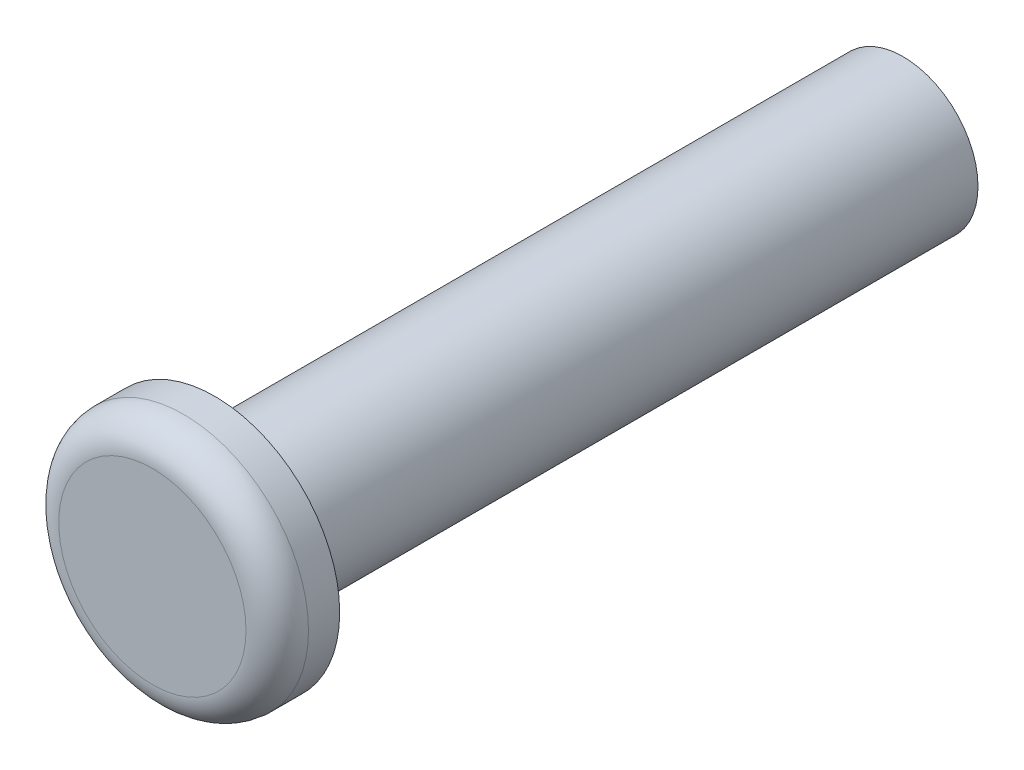
ISO-10303-21;
HEADER;
FILE_DESCRIPTION(('STEP AP214'),'2;1');
FILE_NAME('part.step','',(''),(''),'','','');
FILE_SCHEMA(('AUTOMOTIVE_DESIGN { 1 0 10303 214 1 1 1 1 }'));
ENDSEC;
DATA;
#1=APPLICATION_CONTEXT('core data for automotive mechanical design processes');
#2=APPLICATION_PROTOCOL_DEFINITION('international standard','automotive_design',2000,#1);
#3=PRODUCT_CONTEXT('',#1,'mechanical');
#4=PRODUCT('Part','Part','',(#3));
#5=PRODUCT_RELATED_PRODUCT_CATEGORY('part','',(#4));
#6=PRODUCT_DEFINITION_FORMATION('','',#4);
#7=PRODUCT_DEFINITION_CONTEXT('part definition',#1,'design');
#8=PRODUCT_DEFINITION('design','',#6,#7);
#9=PRODUCT_DEFINITION_SHAPE('','',#8);
#10=(LENGTH_UNIT() NAMED_UNIT(*) SI_UNIT(.MILLI.,.METRE.));
#11=(NAMED_UNIT(*) PLANE_ANGLE_UNIT() SI_UNIT($,.RADIAN.));
#12=(NAMED_UNIT(*) SI_UNIT($,.STERADIAN.) SOLID_ANGLE_UNIT());
#13=UNCERTAINTY_MEASURE_WITH_UNIT(LENGTH_MEASURE(1.E-05),#10,'distance_accuracy_value','');
#14=(GEOMETRIC_REPRESENTATION_CONTEXT(3) GLOBAL_UNCERTAINTY_ASSIGNED_CONTEXT((#13)) GLOBAL_UNIT_ASSIGNED_CONTEXT((#10,
#11,#12)) REPRESENTATION_CONTEXT('',''));
#15=CARTESIAN_POINT('',(0.,0.,0.));
#16=DIRECTION('',(0.,0.,1.));
#17=DIRECTION('',(1.,0.,0.));
#18=AXIS2_PLACEMENT_3D('',#15,#16,#17);
#19=CARTESIAN_POINT('',(0.,0.,-35.));
#20=DIRECTION('',(0.,0.,1.));
#21=DIRECTION('',(1.,0.,0.));
#22=AXIS2_PLACEMENT_3D('',#19,#20,#21);
#23=CYLINDRICAL_SURFACE('',#22,3.81);
#24=CARTESIAN_POINT('',(0.,0.,-35.));
#25=DIRECTION('',(0.,0.,1.));
#26=DIRECTION('',(1.,0.,0.));
#27=AXIS2_PLACEMENT_3D('',#24,#25,#26);
#28=CIRCLE('',#27,3.81);
#29=CARTESIAN_POINT('',(3.81,0.,-35.));
#30=VERTEX_POINT('',#29);
#31=EDGE_CURVE('E43',#30,#30,#28,.T.);
#32=ORIENTED_EDGE('',*,*,#31,.T.);
#33=EDGE_LOOP('',(#32));
#34=FACE_BOUND('',#33,.T.);
#35=CARTESIAN_POINT('',(0.,0.,0.));
#36=DIRECTION('',(0.,0.,1.));
#37=DIRECTION('',(1.,0.,0.));
#38=AXIS2_PLACEMENT_3D('',#35,#36,#37);
#39=CIRCLE('',#38,3.81);
#40=CARTESIAN_POINT('',(3.81,0.,0.));
#41=VERTEX_POINT('',#40);
#42=EDGE_CURVE('E47',#41,#41,#39,.T.);
#43=ORIENTED_EDGE('',*,*,#42,.F.);
#44=EDGE_LOOP('',(#43));
#45=FACE_BOUND('',#44,.T.);
#46=ADVANCED_FACE('F32',(#34,#45),#23,.T.);
#47=CARTESIAN_POINT('',(0.,0.,-35.));
#48=DIRECTION('',(0.,0.,1.));
#49=DIRECTION('',(1.,0.,0.));
#50=AXIS2_PLACEMENT_3D('',#47,#48,#49);
#51=PLANE('',#50);
#52=ORIENTED_EDGE('',*,*,#31,.F.);
#53=EDGE_LOOP('',(#52));
#54=FACE_BOUND('',#53,.T.);
#55=ADVANCED_FACE('F71',(#54),#51,.F.);
#56=CARTESIAN_POINT('',(0.,0.,3.175));
#57=DIRECTION('',(0.,0.,-1.));
#58=DIRECTION('',(-1.,0.,0.));
#59=AXIS2_PLACEMENT_3D('',#56,#57,#58);
#60=CYLINDRICAL_SURFACE('',#59,6.35);
#61=CARTESIAN_POINT('',(0.,0.,1.5875));
#62=DIRECTION('',(0.,0.,1.));
#63=DIRECTION('',(1.,0.,0.));
#64=AXIS2_PLACEMENT_3D('',#61,#62,#63);
#65=CIRCLE('',#64,6.35);
#66=CARTESIAN_POINT('',(6.35,0.,1.5875));
#67=VERTEX_POINT('',#66);
#68=EDGE_CURVE('E10',#67,#67,#65,.F.);
#69=ORIENTED_EDGE('',*,*,#68,.T.);
#70=EDGE_LOOP('',(#69));
#71=FACE_BOUND('',#70,.T.);
#72=CARTESIAN_POINT('',(0.,0.,0.));
#73=DIRECTION('',(0.,0.,1.));
#74=DIRECTION('',(1.,0.,0.));
#75=AXIS2_PLACEMENT_3D('',#72,#73,#74);
#76=CIRCLE('',#75,6.35);
#77=CARTESIAN_POINT('',(6.35,0.,0.));
#78=VERTEX_POINT('',#77);
#79=EDGE_CURVE('E51',#78,#78,#76,.T.);
#80=ORIENTED_EDGE('',*,*,#79,.T.);
#81=EDGE_LOOP('',(#80));
#82=FACE_BOUND('',#81,.T.);
#83=ADVANCED_FACE('F56',(#71,#82),#60,.T.);
#84=CARTESIAN_POINT('',(0.,0.,3.175));
#85=DIRECTION('',(0.,0.,1.));
#86=DIRECTION('',(1.,0.,0.));
#87=AXIS2_PLACEMENT_3D('',#84,#85,#86);
#88=PLANE('',#87);
#89=CARTESIAN_POINT('',(0.,0.,3.175));
#90=DIRECTION('',(0.,0.,1.));
#91=DIRECTION('',(1.,0.,0.));
#92=AXIS2_PLACEMENT_3D('',#89,#90,#91);
#93=CIRCLE('',#92,4.7625);
#94=CARTESIAN_POINT('',(4.7625,0.,3.175));
#95=VERTEX_POINT('',#94);
#96=EDGE_CURVE('E39',#95,#95,#93,.T.);
#97=ORIENTED_EDGE('',*,*,#96,.T.);
#98=EDGE_LOOP('',(#97));
#99=FACE_BOUND('',#98,.T.);
#100=ADVANCED_FACE('F60',(#99),#88,.T.);
#101=CARTESIAN_POINT('',(0.,0.,0.));
#102=DIRECTION('',(0.,0.,1.));
#103=DIRECTION('',(1.,0.,0.));
#104=AXIS2_PLACEMENT_3D('',#101,#102,#103);
#105=PLANE('',#104);
#106=ORIENTED_EDGE('',*,*,#42,.T.);
#107=EDGE_LOOP('',(#106));
#108=FACE_BOUND('',#107,.T.);
#109=ORIENTED_EDGE('',*,*,#79,.F.);
#110=EDGE_LOOP('',(#109));
#111=FACE_BOUND('',#110,.T.);
#112=ADVANCED_FACE('F58',(#108,#111),#105,.F.);
#113=CARTESIAN_POINT('',(0.,0.,1.5875));
#114=DIRECTION('',(0.,0.,1.));
#115=DIRECTION('',(1.,0.,0.));
#116=AXIS2_PLACEMENT_3D('',#113,#114,#115);
#117=TOROIDAL_SURFACE('',#116,4.7625,1.5875);
#118=ORIENTED_EDGE('',*,*,#68,.F.);
#119=EDGE_LOOP('',(#118));
#120=FACE_BOUND('',#119,.T.);
#121=ORIENTED_EDGE('',*,*,#96,.F.);
#122=EDGE_LOOP('',(#121));
#123=FACE_BOUND('',#122,.T.);
#124=ADVANCED_FACE('F34',(#120,#123),#117,.T.);
#125=CLOSED_SHELL('',(#46,#55,#83,#100,#112,#124));
#126=MANIFOLD_SOLID_BREP('B2',#125);
#127=ADVANCED_BREP_SHAPE_REPRESENTATION('',(#18,#126),#14);
#128=SHAPE_DEFINITION_REPRESENTATION(#9,#127);
ENDSEC;
END-ISO-10303-21;
